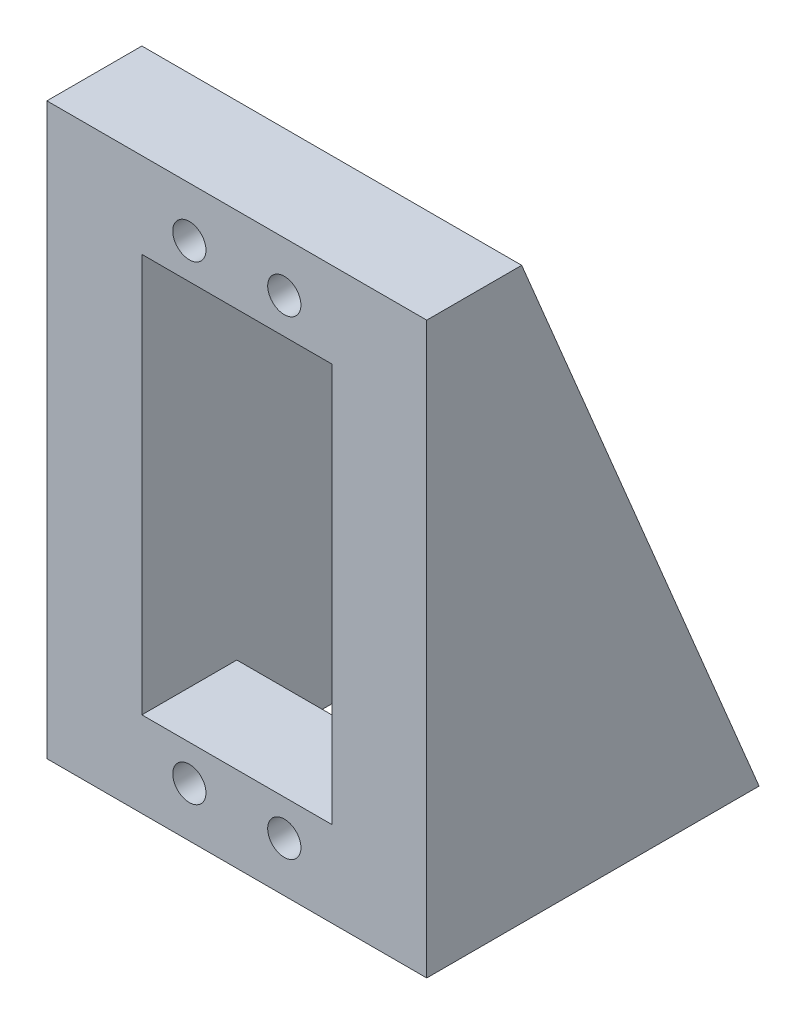
ISO-10303-21;
HEADER;
FILE_DESCRIPTION(('STEP AP214'),'2;1');
FILE_NAME('part.step','',(''),(''),'','','');
FILE_SCHEMA(('AUTOMOTIVE_DESIGN { 1 0 10303 214 1 1 1 1 }'));
ENDSEC;
DATA;
#1=APPLICATION_CONTEXT('core data for automotive mechanical design processes');
#2=APPLICATION_PROTOCOL_DEFINITION('international standard','automotive_design',2000,#1);
#3=PRODUCT_CONTEXT('',#1,'mechanical');
#4=PRODUCT('Part','Part','',(#3));
#5=PRODUCT_RELATED_PRODUCT_CATEGORY('part','',(#4));
#6=PRODUCT_DEFINITION_FORMATION('','',#4);
#7=PRODUCT_DEFINITION_CONTEXT('part definition',#1,'design');
#8=PRODUCT_DEFINITION('design','',#6,#7);
#9=PRODUCT_DEFINITION_SHAPE('','',#8);
#10=(LENGTH_UNIT() NAMED_UNIT(*) SI_UNIT(.MILLI.,.METRE.));
#11=(NAMED_UNIT(*) PLANE_ANGLE_UNIT() SI_UNIT($,.RADIAN.));
#12=(NAMED_UNIT(*) SI_UNIT($,.STERADIAN.) SOLID_ANGLE_UNIT());
#13=UNCERTAINTY_MEASURE_WITH_UNIT(LENGTH_MEASURE(1.E-05),#10,'distance_accuracy_value','');
#14=(GEOMETRIC_REPRESENTATION_CONTEXT(3) GLOBAL_UNCERTAINTY_ASSIGNED_CONTEXT((#13)) GLOBAL_UNIT_ASSIGNED_CONTEXT((#10,
#11,#12)) REPRESENTATION_CONTEXT('',''));
#15=CARTESIAN_POINT('',(0.,0.,0.));
#16=DIRECTION('',(0.,0.,1.));
#17=DIRECTION('',(1.,0.,0.));
#18=AXIS2_PLACEMENT_3D('',#15,#16,#17);
#19=CARTESIAN_POINT('',(0.,-30.,10.));
#20=DIRECTION('',(0.,1.,0.));
#21=DIRECTION('',(-1.,0.,0.));
#22=AXIS2_PLACEMENT_3D('',#19,#20,#21);
#23=PLANE('',#22);
#24=CARTESIAN_POINT('',(-16.,-30.,-6.7433949));
#25=DIRECTION('',(0.,-1.,0.));
#26=DIRECTION('',(1.,0.,0.));
#27=AXIS2_PLACEMENT_3D('',#24,#25,#26);
#28=CIRCLE('',#27,1.25);
#29=CARTESIAN_POINT('',(-14.75,-30.,-6.7433949));
#30=VERTEX_POINT('',#29);
#31=EDGE_CURVE('E563',#30,#30,#28,.T.);
#32=ORIENTED_EDGE('',*,*,#31,.F.);
#33=EDGE_LOOP('',(#32));
#34=FACE_BOUND('',#33,.T.);
#35=CARTESIAN_POINT('',(-16.,-30.,-16.7433949));
#36=DIRECTION('',(0.,-1.,0.));
#37=DIRECTION('',(1.,0.,0.));
#38=AXIS2_PLACEMENT_3D('',#35,#36,#37);
#39=CIRCLE('',#38,1.25);
#40=CARTESIAN_POINT('',(-14.75,-30.,-16.7433949));
#41=VERTEX_POINT('',#40);
#42=EDGE_CURVE('E564',#41,#41,#39,.T.);
#43=ORIENTED_EDGE('',*,*,#42,.F.);
#44=EDGE_LOOP('',(#43));
#45=FACE_BOUND('',#44,.T.);
#46=CARTESIAN_POINT('',(-16.,-30.,3.2566051));
#47=DIRECTION('',(0.,-1.,0.));
#48=DIRECTION('',(1.,0.,0.));
#49=AXIS2_PLACEMENT_3D('',#46,#47,#48);
#50=CIRCLE('',#49,1.25);
#51=CARTESIAN_POINT('',(-14.75,-30.,3.2566051));
#52=VERTEX_POINT('',#51);
#53=EDGE_CURVE('E149',#52,#52,#50,.T.);
#54=ORIENTED_EDGE('',*,*,#53,.F.);
#55=EDGE_LOOP('',(#54));
#56=FACE_BOUND('',#55,.T.);
#57=DIRECTION('',(0.,0.,-1.));
#58=VECTOR('',#57,1.);
#59=CARTESIAN_POINT('',(-20.,-30.,10.));
#60=LINE('',#59,#58);
#61=CARTESIAN_POINT('',(-20.,-30.,10.));
#62=VERTEX_POINT('',#61);
#63=CARTESIAN_POINT('',(-20.,-30.,-25.));
#64=VERTEX_POINT('',#63);
#65=EDGE_CURVE('E118',#62,#64,#60,.T.);
#66=ORIENTED_EDGE('',*,*,#65,.T.);
#67=DIRECTION('',(1.,0.,0.));
#68=VECTOR('',#67,1.);
#69=CARTESIAN_POINT('',(-20.,-30.,-25.));
#70=LINE('',#69,#68);
#71=CARTESIAN_POINT('',(-9.99999999999999,-30.,-25.));
#72=VERTEX_POINT('',#71);
#73=EDGE_CURVE('E122',#64,#72,#70,.T.);
#74=ORIENTED_EDGE('',*,*,#73,.T.);
#75=DIRECTION('',(0.,0.,-1.));
#76=VECTOR('',#75,1.);
#77=CARTESIAN_POINT('',(-9.99999999999999,-30.,0.));
#78=LINE('',#77,#76);
#79=CARTESIAN_POINT('',(-9.99999999999999,-30.,0.));
#80=VERTEX_POINT('',#79);
#81=EDGE_CURVE('E151',#80,#72,#78,.T.);
#82=ORIENTED_EDGE('',*,*,#81,.F.);
#83=DIRECTION('',(1.,0.,0.));
#84=VECTOR('',#83,1.);
#85=CARTESIAN_POINT('',(0.,-30.,0.));
#86=LINE('',#85,#84);
#87=CARTESIAN_POINT('',(10.,-30.,0.));
#88=VERTEX_POINT('',#87);
#89=EDGE_CURVE('E218',#80,#88,#86,.T.);
#90=ORIENTED_EDGE('',*,*,#89,.T.);
#91=DIRECTION('',(0.,0.,-1.));
#92=VECTOR('',#91,1.);
#93=CARTESIAN_POINT('',(10.,-30.,10.));
#94=LINE('',#93,#92);
#95=CARTESIAN_POINT('',(10.,-30.,-25.));
#96=VERTEX_POINT('',#95);
#97=EDGE_CURVE('E159',#88,#96,#94,.T.);
#98=ORIENTED_EDGE('',*,*,#97,.T.);
#99=DIRECTION('',(1.,0.,0.));
#100=VECTOR('',#99,1.);
#101=CARTESIAN_POINT('',(10.,-30.,-25.));
#102=LINE('',#101,#100);
#103=CARTESIAN_POINT('',(20.,-30.,-25.));
#104=VERTEX_POINT('',#103);
#105=EDGE_CURVE('E167',#96,#104,#102,.T.);
#106=ORIENTED_EDGE('',*,*,#105,.T.);
#107=DIRECTION('',(0.,0.,-1.));
#108=VECTOR('',#107,1.);
#109=CARTESIAN_POINT('',(20.,-30.,10.));
#110=LINE('',#109,#108);
#111=CARTESIAN_POINT('',(20.,-30.,10.));
#112=VERTEX_POINT('',#111);
#113=EDGE_CURVE('E226',#112,#104,#110,.T.);
#114=ORIENTED_EDGE('',*,*,#113,.F.);
#115=DIRECTION('',(1.,0.,0.));
#116=VECTOR('',#115,1.);
#117=CARTESIAN_POINT('',(0.,-30.,10.));
#118=LINE('',#117,#116);
#119=EDGE_CURVE('E125',#62,#112,#118,.T.);
#120=ORIENTED_EDGE('',*,*,#119,.F.);
#121=EDGE_LOOP('',(#66,#74,#82,#90,#98,#106,#114,#120));
#122=FACE_BOUND('',#121,.T.);
#123=CARTESIAN_POINT('',(16.,-30.,-16.7433949));
#124=DIRECTION('',(0.,1.,0.));
#125=DIRECTION('',(-1.,0.,0.));
#126=AXIS2_PLACEMENT_3D('',#123,#124,#125);
#127=CIRCLE('',#126,1.25);
#128=CARTESIAN_POINT('',(14.75,-30.,-16.7433949));
#129=VERTEX_POINT('',#128);
#130=EDGE_CURVE('E586',#129,#129,#127,.T.);
#131=ORIENTED_EDGE('',*,*,#130,.T.);
#132=EDGE_LOOP('',(#131));
#133=FACE_BOUND('',#132,.T.);
#134=CARTESIAN_POINT('',(16.,-30.,-6.7433949));
#135=DIRECTION('',(0.,1.,0.));
#136=DIRECTION('',(-1.,0.,0.));
#137=AXIS2_PLACEMENT_3D('',#134,#135,#136);
#138=CIRCLE('',#137,1.25);
#139=CARTESIAN_POINT('',(14.75,-30.,-6.7433949));
#140=VERTEX_POINT('',#139);
#141=EDGE_CURVE('E581',#140,#140,#138,.T.);
#142=ORIENTED_EDGE('',*,*,#141,.T.);
#143=EDGE_LOOP('',(#142));
#144=FACE_BOUND('',#143,.T.);
#145=CARTESIAN_POINT('',(16.,-30.,3.2566051));
#146=DIRECTION('',(0.,1.,0.));
#147=DIRECTION('',(-1.,0.,0.));
#148=AXIS2_PLACEMENT_3D('',#145,#146,#147);
#149=CIRCLE('',#148,1.25);
#150=CARTESIAN_POINT('',(14.75,-30.,3.2566051));
#151=VERTEX_POINT('',#150);
#152=EDGE_CURVE('E575',#151,#151,#149,.T.);
#153=ORIENTED_EDGE('',*,*,#152,.T.);
#154=EDGE_LOOP('',(#153));
#155=FACE_BOUND('',#154,.T.);
#156=ADVANCED_FACE('F34',(#34,#45,#56,#122,#133,#144,#155),#23,.F.);
#157=CARTESIAN_POINT('',(0.,21.,10.));
#158=DIRECTION('',(0.,1.,0.));
#159=DIRECTION('',(0.,0.,1.));
#160=AXIS2_PLACEMENT_3D('',#157,#158,#159);
#161=PLANE('',#160);
#162=DIRECTION('',(0.,0.,1.));
#163=VECTOR('',#162,1.);
#164=CARTESIAN_POINT('',(-9.99999999999998,21.,10.));
#165=LINE('',#164,#163);
#166=CARTESIAN_POINT('',(-9.99999999999998,21.,0.));
#167=VERTEX_POINT('',#166);
#168=CARTESIAN_POINT('',(-9.99999999999998,21.,10.));
#169=VERTEX_POINT('',#168);
#170=EDGE_CURVE('E156',#167,#169,#165,.T.);
#171=ORIENTED_EDGE('',*,*,#170,.F.);
#172=DIRECTION('',(1.,0.,0.));
#173=VECTOR('',#172,1.);
#174=CARTESIAN_POINT('',(0.,21.,0.));
#175=LINE('',#174,#173);
#176=CARTESIAN_POINT('',(10.,21.,0.));
#177=VERTEX_POINT('',#176);
#178=EDGE_CURVE('E208',#167,#177,#175,.T.);
#179=ORIENTED_EDGE('',*,*,#178,.T.);
#180=DIRECTION('',(0.,0.,1.));
#181=VECTOR('',#180,1.);
#182=CARTESIAN_POINT('',(10.,21.,10.));
#183=LINE('',#182,#181);
#184=CARTESIAN_POINT('',(10.,21.,10.));
#185=VERTEX_POINT('',#184);
#186=EDGE_CURVE('E177',#177,#185,#183,.T.);
#187=ORIENTED_EDGE('',*,*,#186,.T.);
#188=DIRECTION('',(1.,0.,0.));
#189=VECTOR('',#188,1.);
#190=CARTESIAN_POINT('',(0.,21.,10.));
#191=LINE('',#190,#189);
#192=EDGE_CURVE('E57',#169,#185,#191,.T.);
#193=ORIENTED_EDGE('',*,*,#192,.F.);
#194=EDGE_LOOP('',(#171,#179,#187,#193));
#195=FACE_BOUND('',#194,.T.);
#196=ADVANCED_FACE('F288',(#195),#161,.F.);
#197=CARTESIAN_POINT('',(0.,-21.,10.));
#198=DIRECTION('',(0.,1.,0.));
#199=DIRECTION('',(0.,0.,1.));
#200=AXIS2_PLACEMENT_3D('',#197,#198,#199);
#201=PLANE('',#200);
#202=DIRECTION('',(1.,0.,0.));
#203=VECTOR('',#202,1.);
#204=CARTESIAN_POINT('',(0.,-21.,0.));
#205=LINE('',#204,#203);
#206=CARTESIAN_POINT('',(-9.99999999999998,-21.,0.));
#207=VERTEX_POINT('',#206);
#208=CARTESIAN_POINT('',(10.,-21.,0.));
#209=VERTEX_POINT('',#208);
#210=EDGE_CURVE('E210',#207,#209,#205,.T.);
#211=ORIENTED_EDGE('',*,*,#210,.F.);
#212=DIRECTION('',(0.,0.,1.));
#213=VECTOR('',#212,1.);
#214=CARTESIAN_POINT('',(-9.99999999999999,-21.,10.));
#215=LINE('',#214,#213);
#216=CARTESIAN_POINT('',(-9.99999999999998,-21.,10.));
#217=VERTEX_POINT('',#216);
#218=EDGE_CURVE('E49',#207,#217,#215,.T.);
#219=ORIENTED_EDGE('',*,*,#218,.T.);
#220=DIRECTION('',(1.,0.,0.));
#221=VECTOR('',#220,1.);
#222=CARTESIAN_POINT('',(0.,-21.,10.));
#223=LINE('',#222,#221);
#224=CARTESIAN_POINT('',(10.,-21.,10.));
#225=VERTEX_POINT('',#224);
#226=EDGE_CURVE('E188',#217,#225,#223,.T.);
#227=ORIENTED_EDGE('',*,*,#226,.T.);
#228=DIRECTION('',(0.,0.,1.));
#229=VECTOR('',#228,1.);
#230=CARTESIAN_POINT('',(10.,-21.,10.));
#231=LINE('',#230,#229);
#232=EDGE_CURVE('E172',#209,#225,#231,.T.);
#233=ORIENTED_EDGE('',*,*,#232,.F.);
#234=EDGE_LOOP('',(#211,#219,#227,#233));
#235=FACE_BOUND('',#234,.T.);
#236=ADVANCED_FACE('F283',(#235),#201,.T.);
#237=CARTESIAN_POINT('',(0.,0.,0.));
#238=DIRECTION('',(0.,0.,1.));
#239=DIRECTION('',(1.,0.,0.));
#240=AXIS2_PLACEMENT_3D('',#237,#238,#239);
#241=PLANE('',#240);
#242=CARTESIAN_POINT('',(-5.,24.75,0.));
#243=DIRECTION('',(0.,0.,1.));
#244=DIRECTION('',(1.,0.,0.));
#245=AXIS2_PLACEMENT_3D('',#242,#243,#244);
#246=CIRCLE('',#245,1.75);
#247=CARTESIAN_POINT('',(-3.25,24.75,0.));
#248=VERTEX_POINT('',#247);
#249=EDGE_CURVE('E215',#248,#248,#246,.T.);
#250=ORIENTED_EDGE('',*,*,#249,.T.);
#251=EDGE_LOOP('',(#250));
#252=FACE_BOUND('',#251,.T.);
#253=CARTESIAN_POINT('',(5.,24.75,0.));
#254=DIRECTION('',(0.,0.,1.));
#255=DIRECTION('',(1.,0.,0.));
#256=AXIS2_PLACEMENT_3D('',#253,#254,#255);
#257=CIRCLE('',#256,1.75);
#258=CARTESIAN_POINT('',(6.75,24.75,0.));
#259=VERTEX_POINT('',#258);
#260=EDGE_CURVE('E212',#259,#259,#257,.T.);
#261=ORIENTED_EDGE('',*,*,#260,.T.);
#262=EDGE_LOOP('',(#261));
#263=FACE_BOUND('',#262,.T.);
#264=DIRECTION('',(0.,-1.,0.));
#265=VECTOR('',#264,1.);
#266=CARTESIAN_POINT('',(-9.99999999999998,0.,0.));
#267=LINE('',#266,#265);
#268=CARTESIAN_POINT('',(-9.99999999999998,30.,0.));
#269=VERTEX_POINT('',#268);
#270=EDGE_CURVE('E11',#269,#167,#267,.T.);
#271=ORIENTED_EDGE('',*,*,#270,.F.);
#272=DIRECTION('',(1.,0.,0.));
#273=VECTOR('',#272,1.);
#274=CARTESIAN_POINT('',(0.,30.,0.));
#275=LINE('',#274,#273);
#276=CARTESIAN_POINT('',(10.,30.,0.));
#277=VERTEX_POINT('',#276);
#278=EDGE_CURVE('E220',#269,#277,#275,.T.);
#279=ORIENTED_EDGE('',*,*,#278,.T.);
#280=DIRECTION('',(0.,-1.,0.));
#281=VECTOR('',#280,1.);
#282=CARTESIAN_POINT('',(10.,0.,0.));
#283=LINE('',#282,#281);
#284=EDGE_CURVE('E229',#277,#177,#283,.T.);
#285=ORIENTED_EDGE('',*,*,#284,.T.);
#286=ORIENTED_EDGE('',*,*,#178,.F.);
#287=EDGE_LOOP('',(#271,#279,#285,#286));
#288=FACE_BOUND('',#287,.T.);
#289=ADVANCED_FACE('F279',(#252,#263,#288),#241,.F.);
#290=CARTESIAN_POINT('',(-4.99999999999999,-24.75,0.));
#291=DIRECTION('',(0.,0.,1.));
#292=DIRECTION('',(1.,0.,0.));
#293=AXIS2_PLACEMENT_3D('',#290,#291,#292);
#294=CIRCLE('',#293,1.75);
#295=CARTESIAN_POINT('',(-3.24999999999999,-24.75,0.));
#296=VERTEX_POINT('',#295);
#297=EDGE_CURVE('E205',#296,#296,#294,.T.);
#298=ORIENTED_EDGE('',*,*,#297,.T.);
#299=EDGE_LOOP('',(#298));
#300=FACE_BOUND('',#299,.T.);
#301=CARTESIAN_POINT('',(5.,-24.75,0.));
#302=DIRECTION('',(0.,0.,1.));
#303=DIRECTION('',(1.,0.,0.));
#304=AXIS2_PLACEMENT_3D('',#301,#302,#303);
#305=CIRCLE('',#304,1.75);
#306=CARTESIAN_POINT('',(6.75000000000001,-24.75,0.));
#307=VERTEX_POINT('',#306);
#308=EDGE_CURVE('E179',#307,#307,#305,.T.);
#309=ORIENTED_EDGE('',*,*,#308,.T.);
#310=EDGE_LOOP('',(#309));
#311=FACE_BOUND('',#310,.T.);
#312=EDGE_CURVE('E38',#207,#80,#267,.T.);
#313=ORIENTED_EDGE('',*,*,#312,.F.);
#314=ORIENTED_EDGE('',*,*,#210,.T.);
#315=EDGE_CURVE('E227',#209,#88,#283,.T.);
#316=ORIENTED_EDGE('',*,*,#315,.T.);
#317=ORIENTED_EDGE('',*,*,#89,.F.);
#318=EDGE_LOOP('',(#313,#314,#316,#317));
#319=FACE_BOUND('',#318,.T.);
#320=ADVANCED_FACE('F282',(#300,#311,#319),#241,.F.);
#321=CARTESIAN_POINT('',(20.,0.,10.));
#322=DIRECTION('',(-1.,0.,0.));
#323=DIRECTION('',(0.,-1.,0.));
#324=AXIS2_PLACEMENT_3D('',#321,#322,#323);
#325=PLANE('',#324);
#326=ORIENTED_EDGE('',*,*,#113,.T.);
#327=DIRECTION('',(0.,0.923076923076923,0.384615384615385));
#328=VECTOR('',#327,1.);
#329=CARTESIAN_POINT('',(20.,-30.,-25.));
#330=LINE('',#329,#328);
#331=CARTESIAN_POINT('',(20.,30.,0.));
#332=VERTEX_POINT('',#331);
#333=EDGE_CURVE('E158',#104,#332,#330,.T.);
#334=ORIENTED_EDGE('',*,*,#333,.T.);
#335=DIRECTION('',(0.,0.,-1.));
#336=VECTOR('',#335,1.);
#337=CARTESIAN_POINT('',(20.,30.,10.));
#338=LINE('',#337,#336);
#339=CARTESIAN_POINT('',(20.,30.,10.));
#340=VERTEX_POINT('',#339);
#341=EDGE_CURVE('E223',#340,#332,#338,.T.);
#342=ORIENTED_EDGE('',*,*,#341,.F.);
#343=DIRECTION('',(0.,1.,0.));
#344=VECTOR('',#343,1.);
#345=CARTESIAN_POINT('',(20.,0.,10.));
#346=LINE('',#345,#344);
#347=EDGE_CURVE('E197',#112,#340,#346,.T.);
#348=ORIENTED_EDGE('',*,*,#347,.F.);
#349=EDGE_LOOP('',(#326,#334,#342,#348));
#350=FACE_BOUND('',#349,.T.);
#351=ADVANCED_FACE('F257',(#350),#325,.F.);
#352=CARTESIAN_POINT('',(0.,30.,10.));
#353=DIRECTION('',(0.,1.,0.));
#354=DIRECTION('',(0.,0.,1.));
#355=AXIS2_PLACEMENT_3D('',#352,#353,#354);
#356=PLANE('',#355);
#357=DIRECTION('',(1.,0.,0.));
#358=VECTOR('',#357,1.);
#359=CARTESIAN_POINT('',(0.,30.,10.));
#360=LINE('',#359,#358);
#361=CARTESIAN_POINT('',(-20.,30.,10.));
#362=VERTEX_POINT('',#361);
#363=EDGE_CURVE('E200',#362,#340,#360,.T.);
#364=ORIENTED_EDGE('',*,*,#363,.T.);
#365=ORIENTED_EDGE('',*,*,#341,.T.);
#366=DIRECTION('',(1.,0.,0.));
#367=VECTOR('',#366,1.);
#368=CARTESIAN_POINT('',(10.,30.,0.));
#369=LINE('',#368,#367);
#370=EDGE_CURVE('E169',#277,#332,#369,.T.);
#371=ORIENTED_EDGE('',*,*,#370,.F.);
#372=ORIENTED_EDGE('',*,*,#278,.F.);
#373=CARTESIAN_POINT('',(-20.,30.,0.));
#374=VERTEX_POINT('',#373);
#375=EDGE_CURVE('E184',#374,#269,#275,.T.);
#376=ORIENTED_EDGE('',*,*,#375,.F.);
#377=DIRECTION('',(0.,0.,-1.));
#378=VECTOR('',#377,1.);
#379=CARTESIAN_POINT('',(-20.,30.,10.));
#380=LINE('',#379,#378);
#381=EDGE_CURVE('E130',#362,#374,#380,.T.);
#382=ORIENTED_EDGE('',*,*,#381,.F.);
#383=EDGE_LOOP('',(#364,#365,#371,#372,#376,#382));
#384=FACE_BOUND('',#383,.T.);
#385=ADVANCED_FACE('F252',(#384),#356,.T.);
#386=CARTESIAN_POINT('',(-5.,24.75,10.));
#387=DIRECTION('',(0.,0.,-1.));
#388=DIRECTION('',(-1.,0.,0.));
#389=AXIS2_PLACEMENT_3D('',#386,#387,#388);
#390=CYLINDRICAL_SURFACE('',#389,1.75);
#391=CARTESIAN_POINT('',(-5.,24.75,10.));
#392=DIRECTION('',(0.,0.,1.));
#393=DIRECTION('',(1.,0.,0.));
#394=AXIS2_PLACEMENT_3D('',#391,#392,#393);
#395=CIRCLE('',#394,1.75);
#396=CARTESIAN_POINT('',(-3.25,24.75,10.));
#397=VERTEX_POINT('',#396);
#398=EDGE_CURVE('E193',#397,#397,#395,.T.);
#399=ORIENTED_EDGE('',*,*,#398,.T.);
#400=EDGE_LOOP('',(#399));
#401=FACE_BOUND('',#400,.T.);
#402=ORIENTED_EDGE('',*,*,#249,.F.);
#403=EDGE_LOOP('',(#402));
#404=FACE_BOUND('',#403,.T.);
#405=ADVANCED_FACE('F272',(#401,#404),#390,.F.);
#406=CARTESIAN_POINT('',(5.,24.75,10.));
#407=DIRECTION('',(0.,0.,-1.));
#408=DIRECTION('',(-1.,0.,0.));
#409=AXIS2_PLACEMENT_3D('',#406,#407,#408);
#410=CYLINDRICAL_SURFACE('',#409,1.75);
#411=CARTESIAN_POINT('',(5.,24.75,10.));
#412=DIRECTION('',(0.,0.,1.));
#413=DIRECTION('',(1.,0.,0.));
#414=AXIS2_PLACEMENT_3D('',#411,#412,#413);
#415=CIRCLE('',#414,1.75);
#416=CARTESIAN_POINT('',(6.75,24.75,10.));
#417=VERTEX_POINT('',#416);
#418=EDGE_CURVE('E190',#417,#417,#415,.T.);
#419=ORIENTED_EDGE('',*,*,#418,.T.);
#420=EDGE_LOOP('',(#419));
#421=FACE_BOUND('',#420,.T.);
#422=ORIENTED_EDGE('',*,*,#260,.F.);
#423=EDGE_LOOP('',(#422));
#424=FACE_BOUND('',#423,.T.);
#425=ADVANCED_FACE('F275',(#421,#424),#410,.F.);
#426=CARTESIAN_POINT('',(-4.99999999999999,-24.75,10.));
#427=DIRECTION('',(0.,0.,-1.));
#428=DIRECTION('',(-1.,0.,0.));
#429=AXIS2_PLACEMENT_3D('',#426,#427,#428);
#430=CYLINDRICAL_SURFACE('',#429,1.75);
#431=CARTESIAN_POINT('',(-4.99999999999999,-24.75,10.));
#432=DIRECTION('',(0.,0.,1.));
#433=DIRECTION('',(1.,0.,0.));
#434=AXIS2_PLACEMENT_3D('',#431,#432,#433);
#435=CIRCLE('',#434,1.75);
#436=CARTESIAN_POINT('',(-3.24999999999999,-24.75,10.));
#437=VERTEX_POINT('',#436);
#438=EDGE_CURVE('E183',#437,#437,#435,.T.);
#439=ORIENTED_EDGE('',*,*,#438,.T.);
#440=EDGE_LOOP('',(#439));
#441=FACE_BOUND('',#440,.T.);
#442=ORIENTED_EDGE('',*,*,#297,.F.);
#443=EDGE_LOOP('',(#442));
#444=FACE_BOUND('',#443,.T.);
#445=ADVANCED_FACE('F299',(#441,#444),#430,.F.);
#446=CARTESIAN_POINT('',(5.,-24.75,10.));
#447=DIRECTION('',(0.,0.,-1.));
#448=DIRECTION('',(-1.,0.,0.));
#449=AXIS2_PLACEMENT_3D('',#446,#447,#448);
#450=CYLINDRICAL_SURFACE('',#449,1.75);
#451=CARTESIAN_POINT('',(5.,-24.75,10.));
#452=DIRECTION('',(0.,0.,1.));
#453=DIRECTION('',(1.,0.,0.));
#454=AXIS2_PLACEMENT_3D('',#451,#452,#453);
#455=CIRCLE('',#454,1.75);
#456=CARTESIAN_POINT('',(6.75000000000001,-24.75,10.));
#457=VERTEX_POINT('',#456);
#458=EDGE_CURVE('E180',#457,#457,#455,.T.);
#459=ORIENTED_EDGE('',*,*,#458,.T.);
#460=EDGE_LOOP('',(#459));
#461=FACE_BOUND('',#460,.T.);
#462=ORIENTED_EDGE('',*,*,#308,.F.);
#463=EDGE_LOOP('',(#462));
#464=FACE_BOUND('',#463,.T.);
#465=ADVANCED_FACE('F36',(#461,#464),#450,.F.);
#466=CARTESIAN_POINT('',(-20.,0.,10.));
#467=DIRECTION('',(-1.,0.,0.));
#468=DIRECTION('',(0.,-1.,0.));
#469=AXIS2_PLACEMENT_3D('',#466,#467,#468);
#470=PLANE('',#469);
#471=ORIENTED_EDGE('',*,*,#381,.T.);
#472=DIRECTION('',(0.,0.923076923076923,0.384615384615385));
#473=VECTOR('',#472,1.);
#474=CARTESIAN_POINT('',(-20.,-30.,-25.));
#475=LINE('',#474,#473);
#476=EDGE_CURVE('E137',#64,#374,#475,.T.);
#477=ORIENTED_EDGE('',*,*,#476,.F.);
#478=ORIENTED_EDGE('',*,*,#65,.F.);
#479=DIRECTION('',(0.,1.,0.));
#480=VECTOR('',#479,1.);
#481=CARTESIAN_POINT('',(-20.,0.,10.));
#482=LINE('',#481,#480);
#483=EDGE_CURVE('E131',#62,#362,#482,.T.);
#484=ORIENTED_EDGE('',*,*,#483,.T.);
#485=EDGE_LOOP('',(#471,#477,#478,#484));
#486=FACE_BOUND('',#485,.T.);
#487=ADVANCED_FACE('F141',(#486),#470,.T.);
#488=CARTESIAN_POINT('',(0.,0.,10.));
#489=DIRECTION('',(0.,0.,1.));
#490=DIRECTION('',(1.,0.,0.));
#491=AXIS2_PLACEMENT_3D('',#488,#489,#490);
#492=PLANE('',#491);
#493=DIRECTION('',(0.,-1.,0.));
#494=VECTOR('',#493,1.);
#495=CARTESIAN_POINT('',(-9.99999999999998,30.,10.));
#496=LINE('',#495,#494);
#497=EDGE_CURVE('E143',#169,#217,#496,.T.);
#498=ORIENTED_EDGE('',*,*,#497,.F.);
#499=ORIENTED_EDGE('',*,*,#192,.T.);
#500=DIRECTION('',(0.,-1.,0.));
#501=VECTOR('',#500,1.);
#502=CARTESIAN_POINT('',(10.,30.,10.));
#503=LINE('',#502,#501);
#504=EDGE_CURVE('E164',#185,#225,#503,.T.);
#505=ORIENTED_EDGE('',*,*,#504,.T.);
#506=ORIENTED_EDGE('',*,*,#226,.F.);
#507=EDGE_LOOP('',(#498,#499,#505,#506));
#508=FACE_BOUND('',#507,.T.);
#509=ORIENTED_EDGE('',*,*,#347,.T.);
#510=ORIENTED_EDGE('',*,*,#363,.F.);
#511=ORIENTED_EDGE('',*,*,#483,.F.);
#512=ORIENTED_EDGE('',*,*,#119,.T.);
#513=EDGE_LOOP('',(#509,#510,#511,#512));
#514=FACE_BOUND('',#513,.T.);
#515=ORIENTED_EDGE('',*,*,#458,.F.);
#516=EDGE_LOOP('',(#515));
#517=FACE_BOUND('',#516,.T.);
#518=ORIENTED_EDGE('',*,*,#438,.F.);
#519=EDGE_LOOP('',(#518));
#520=FACE_BOUND('',#519,.T.);
#521=ORIENTED_EDGE('',*,*,#418,.F.);
#522=EDGE_LOOP('',(#521));
#523=FACE_BOUND('',#522,.T.);
#524=ORIENTED_EDGE('',*,*,#398,.F.);
#525=EDGE_LOOP('',(#524));
#526=FACE_BOUND('',#525,.T.);
#527=ADVANCED_FACE('F259',(#508,#514,#517,#520,#523,#526),#492,.T.);
#528=CARTESIAN_POINT('',(10.,0.,0.));
#529=DIRECTION('',(-1.,0.,0.));
#530=DIRECTION('',(0.,-1.,0.));
#531=AXIS2_PLACEMENT_3D('',#528,#529,#530);
#532=PLANE('',#531);
#533=ORIENTED_EDGE('',*,*,#186,.F.);
#534=ORIENTED_EDGE('',*,*,#284,.F.);
#535=DIRECTION('',(0.,0.923076923076923,0.384615384615385));
#536=VECTOR('',#535,1.);
#537=CARTESIAN_POINT('',(10.,-30.,-25.));
#538=LINE('',#537,#536);
#539=EDGE_CURVE('E161',#96,#277,#538,.T.);
#540=ORIENTED_EDGE('',*,*,#539,.F.);
#541=ORIENTED_EDGE('',*,*,#97,.F.);
#542=ORIENTED_EDGE('',*,*,#315,.F.);
#543=ORIENTED_EDGE('',*,*,#232,.T.);
#544=ORIENTED_EDGE('',*,*,#504,.F.);
#545=EDGE_LOOP('',(#533,#534,#540,#541,#542,#543,#544));
#546=FACE_BOUND('',#545,.T.);
#547=ADVANCED_FACE('F244',(#546),#532,.T.);
#548=CARTESIAN_POINT('',(10.,-30.,-25.));
#549=DIRECTION('',(0.,0.384615384615385,-0.923076923076923));
#550=DIRECTION('',(0.,0.923076923076923,0.384615384615385));
#551=AXIS2_PLACEMENT_3D('',#548,#549,#550);
#552=PLANE('',#551);
#553=ORIENTED_EDGE('',*,*,#333,.F.);
#554=ORIENTED_EDGE('',*,*,#105,.F.);
#555=ORIENTED_EDGE('',*,*,#539,.T.);
#556=ORIENTED_EDGE('',*,*,#370,.T.);
#557=EDGE_LOOP('',(#553,#554,#555,#556));
#558=FACE_BOUND('',#557,.T.);
#559=ADVANCED_FACE('F249',(#558),#552,.T.);
#560=CARTESIAN_POINT('',(-9.99999999999998,0.,0.));
#561=DIRECTION('',(-1.,0.,0.));
#562=DIRECTION('',(0.,-1.,0.));
#563=AXIS2_PLACEMENT_3D('',#560,#561,#562);
#564=PLANE('',#563);
#565=ORIENTED_EDGE('',*,*,#270,.T.);
#566=ORIENTED_EDGE('',*,*,#170,.T.);
#567=ORIENTED_EDGE('',*,*,#497,.T.);
#568=ORIENTED_EDGE('',*,*,#218,.F.);
#569=ORIENTED_EDGE('',*,*,#312,.T.);
#570=ORIENTED_EDGE('',*,*,#81,.T.);
#571=DIRECTION('',(0.,0.923076923076923,0.384615384615385));
#572=VECTOR('',#571,1.);
#573=CARTESIAN_POINT('',(-9.99999999999999,-30.,-25.));
#574=LINE('',#573,#572);
#575=EDGE_CURVE('E139',#72,#269,#574,.T.);
#576=ORIENTED_EDGE('',*,*,#575,.T.);
#577=EDGE_LOOP('',(#565,#566,#567,#568,#569,#570,#576));
#578=FACE_BOUND('',#577,.T.);
#579=ADVANCED_FACE('F238',(#578),#564,.F.);
#580=CARTESIAN_POINT('',(-20.,-30.,-25.));
#581=DIRECTION('',(0.,0.384615384615385,-0.923076923076923));
#582=DIRECTION('',(0.,0.923076923076923,0.384615384615385));
#583=AXIS2_PLACEMENT_3D('',#580,#581,#582);
#584=PLANE('',#583);
#585=ORIENTED_EDGE('',*,*,#575,.F.);
#586=ORIENTED_EDGE('',*,*,#73,.F.);
#587=ORIENTED_EDGE('',*,*,#476,.T.);
#588=ORIENTED_EDGE('',*,*,#375,.T.);
#589=EDGE_LOOP('',(#585,#586,#587,#588));
#590=FACE_BOUND('',#589,.T.);
#591=ADVANCED_FACE('F135',(#590),#584,.T.);
#592=CARTESIAN_POINT('',(-16.,-18.,3.2566051));
#593=DIRECTION('',(0.,-1.,0.));
#594=DIRECTION('',(1.,0.,0.));
#595=AXIS2_PLACEMENT_3D('',#592,#593,#594);
#596=CYLINDRICAL_SURFACE('',#595,1.25);
#597=CARTESIAN_POINT('',(-16.,-18.,3.2566051));
#598=DIRECTION('',(0.,-1.,0.));
#599=DIRECTION('',(1.,0.,0.));
#600=AXIS2_PLACEMENT_3D('',#597,#598,#599);
#601=CIRCLE('',#600,1.25);
#602=CARTESIAN_POINT('',(-14.75,-18.,3.2566051));
#603=VERTEX_POINT('',#602);
#604=EDGE_CURVE('E153',#603,#603,#601,.T.);
#605=ORIENTED_EDGE('',*,*,#604,.F.);
#606=EDGE_LOOP('',(#605));
#607=FACE_BOUND('',#606,.T.);
#608=ORIENTED_EDGE('',*,*,#53,.T.);
#609=EDGE_LOOP('',(#608));
#610=FACE_BOUND('',#609,.T.);
#611=ADVANCED_FACE('F420',(#607,#610),#596,.F.);
#612=CARTESIAN_POINT('',(-16.,-18.,3.2566051));
#613=DIRECTION('',(0.,-1.,0.));
#614=DIRECTION('',(1.,0.,0.));
#615=AXIS2_PLACEMENT_3D('',#612,#613,#614);
#616=PLANE('',#615);
#617=ORIENTED_EDGE('',*,*,#604,.T.);
#618=EDGE_LOOP('',(#617));
#619=FACE_BOUND('',#618,.T.);
#620=ADVANCED_FACE('F445',(#619),#616,.T.);
#621=CARTESIAN_POINT('',(16.,-18.,-16.7433949));
#622=DIRECTION('',(0.,-1.,0.));
#623=DIRECTION('',(1.,0.,0.));
#624=AXIS2_PLACEMENT_3D('',#621,#622,#623);
#625=CYLINDRICAL_SURFACE('',#624,1.25);
#626=CARTESIAN_POINT('',(16.,-18.,-16.7433949));
#627=DIRECTION('',(0.,1.,0.));
#628=DIRECTION('',(-1.,0.,0.));
#629=AXIS2_PLACEMENT_3D('',#626,#627,#628);
#630=CIRCLE('',#629,1.25);
#631=CARTESIAN_POINT('',(14.75,-18.,-16.7433949));
#632=VERTEX_POINT('',#631);
#633=EDGE_CURVE('E595',#632,#632,#630,.T.);
#634=ORIENTED_EDGE('',*,*,#633,.T.);
#635=EDGE_LOOP('',(#634));
#636=FACE_BOUND('',#635,.T.);
#637=ORIENTED_EDGE('',*,*,#130,.F.);
#638=EDGE_LOOP('',(#637));
#639=FACE_BOUND('',#638,.T.);
#640=ADVANCED_FACE('F454',(#636,#639),#625,.F.);
#641=CARTESIAN_POINT('',(16.,-18.,-16.7433949));
#642=DIRECTION('',(0.,1.,0.));
#643=DIRECTION('',(-1.,0.,0.));
#644=AXIS2_PLACEMENT_3D('',#641,#642,#643);
#645=PLANE('',#644);
#646=ORIENTED_EDGE('',*,*,#633,.F.);
#647=EDGE_LOOP('',(#646));
#648=FACE_BOUND('',#647,.T.);
#649=ADVANCED_FACE('F463',(#648),#645,.F.);
#650=CARTESIAN_POINT('',(16.,-18.,-6.7433949));
#651=DIRECTION('',(0.,-1.,0.));
#652=DIRECTION('',(1.,0.,0.));
#653=AXIS2_PLACEMENT_3D('',#650,#651,#652);
#654=CYLINDRICAL_SURFACE('',#653,1.25);
#655=CARTESIAN_POINT('',(16.,-18.,-6.7433949));
#656=DIRECTION('',(0.,1.,0.));
#657=DIRECTION('',(-1.,0.,0.));
#658=AXIS2_PLACEMENT_3D('',#655,#656,#657);
#659=CIRCLE('',#658,1.25);
#660=CARTESIAN_POINT('',(14.75,-18.,-6.7433949));
#661=VERTEX_POINT('',#660);
#662=EDGE_CURVE('E584',#661,#661,#659,.T.);
#663=ORIENTED_EDGE('',*,*,#662,.T.);
#664=EDGE_LOOP('',(#663));
#665=FACE_BOUND('',#664,.T.);
#666=ORIENTED_EDGE('',*,*,#141,.F.);
#667=EDGE_LOOP('',(#666));
#668=FACE_BOUND('',#667,.T.);
#669=ADVANCED_FACE('F472',(#665,#668),#654,.F.);
#670=CARTESIAN_POINT('',(16.,-18.,-6.7433949));
#671=DIRECTION('',(0.,1.,0.));
#672=DIRECTION('',(-1.,0.,0.));
#673=AXIS2_PLACEMENT_3D('',#670,#671,#672);
#674=PLANE('',#673);
#675=ORIENTED_EDGE('',*,*,#662,.F.);
#676=EDGE_LOOP('',(#675));
#677=FACE_BOUND('',#676,.T.);
#678=ADVANCED_FACE('F481',(#677),#674,.F.);
#679=CARTESIAN_POINT('',(16.,-18.,3.2566051));
#680=DIRECTION('',(0.,-1.,0.));
#681=DIRECTION('',(1.,0.,0.));
#682=AXIS2_PLACEMENT_3D('',#679,#680,#681);
#683=CYLINDRICAL_SURFACE('',#682,1.25);
#684=CARTESIAN_POINT('',(16.,-18.,3.2566051));
#685=DIRECTION('',(0.,1.,0.));
#686=DIRECTION('',(-1.,0.,0.));
#687=AXIS2_PLACEMENT_3D('',#684,#685,#686);
#688=CIRCLE('',#687,1.25);
#689=CARTESIAN_POINT('',(14.75,-18.,3.2566051));
#690=VERTEX_POINT('',#689);
#691=EDGE_CURVE('E578',#690,#690,#688,.T.);
#692=ORIENTED_EDGE('',*,*,#691,.T.);
#693=EDGE_LOOP('',(#692));
#694=FACE_BOUND('',#693,.T.);
#695=ORIENTED_EDGE('',*,*,#152,.F.);
#696=EDGE_LOOP('',(#695));
#697=FACE_BOUND('',#696,.T.);
#698=ADVANCED_FACE('F490',(#694,#697),#683,.F.);
#699=CARTESIAN_POINT('',(16.,-18.,3.2566051));
#700=DIRECTION('',(0.,1.,0.));
#701=DIRECTION('',(-1.,0.,0.));
#702=AXIS2_PLACEMENT_3D('',#699,#700,#701);
#703=PLANE('',#702);
#704=ORIENTED_EDGE('',*,*,#691,.F.);
#705=EDGE_LOOP('',(#704));
#706=FACE_BOUND('',#705,.T.);
#707=ADVANCED_FACE('F499',(#706),#703,.F.);
#708=CARTESIAN_POINT('',(-16.,-18.,-16.7433949));
#709=DIRECTION('',(0.,-1.,0.));
#710=DIRECTION('',(1.,0.,0.));
#711=AXIS2_PLACEMENT_3D('',#708,#709,#710);
#712=CYLINDRICAL_SURFACE('',#711,1.25);
#713=CARTESIAN_POINT('',(-16.,-18.,-16.7433949));
#714=DIRECTION('',(0.,-1.,0.));
#715=DIRECTION('',(1.,0.,0.));
#716=AXIS2_PLACEMENT_3D('',#713,#714,#715);
#717=CIRCLE('',#716,1.25);
#718=CARTESIAN_POINT('',(-14.75,-18.,-16.7433949));
#719=VERTEX_POINT('',#718);
#720=EDGE_CURVE('E569',#719,#719,#717,.T.);
#721=ORIENTED_EDGE('',*,*,#720,.F.);
#722=EDGE_LOOP('',(#721));
#723=FACE_BOUND('',#722,.T.);
#724=ORIENTED_EDGE('',*,*,#42,.T.);
#725=EDGE_LOOP('',(#724));
#726=FACE_BOUND('',#725,.T.);
#727=ADVANCED_FACE('F508',(#723,#726),#712,.F.);
#728=CARTESIAN_POINT('',(-16.,-18.,-16.7433949));
#729=DIRECTION('',(0.,-1.,0.));
#730=DIRECTION('',(1.,0.,0.));
#731=AXIS2_PLACEMENT_3D('',#728,#729,#730);
#732=PLANE('',#731);
#733=ORIENTED_EDGE('',*,*,#720,.T.);
#734=EDGE_LOOP('',(#733));
#735=FACE_BOUND('',#734,.T.);
#736=ADVANCED_FACE('F517',(#735),#732,.T.);
#737=CARTESIAN_POINT('',(-16.,-18.,-6.7433949));
#738=DIRECTION('',(0.,-1.,0.));
#739=DIRECTION('',(1.,0.,0.));
#740=AXIS2_PLACEMENT_3D('',#737,#738,#739);
#741=CYLINDRICAL_SURFACE('',#740,1.25);
#742=CARTESIAN_POINT('',(-16.,-18.,-6.7433949));
#743=DIRECTION('',(0.,-1.,0.));
#744=DIRECTION('',(1.,0.,0.));
#745=AXIS2_PLACEMENT_3D('',#742,#743,#744);
#746=CIRCLE('',#745,1.25);
#747=CARTESIAN_POINT('',(-14.75,-18.,-6.7433949));
#748=VERTEX_POINT('',#747);
#749=EDGE_CURVE('E562',#748,#748,#746,.T.);
#750=ORIENTED_EDGE('',*,*,#749,.F.);
#751=EDGE_LOOP('',(#750));
#752=FACE_BOUND('',#751,.T.);
#753=ORIENTED_EDGE('',*,*,#31,.T.);
#754=EDGE_LOOP('',(#753));
#755=FACE_BOUND('',#754,.T.);
#756=ADVANCED_FACE('F526',(#752,#755),#741,.F.);
#757=CARTESIAN_POINT('',(-16.,-18.,-6.7433949));
#758=DIRECTION('',(0.,-1.,0.));
#759=DIRECTION('',(1.,0.,0.));
#760=AXIS2_PLACEMENT_3D('',#757,#758,#759);
#761=PLANE('',#760);
#762=ORIENTED_EDGE('',*,*,#749,.T.);
#763=EDGE_LOOP('',(#762));
#764=FACE_BOUND('',#763,.T.);
#765=ADVANCED_FACE('F535',(#764),#761,.T.);
#766=CLOSED_SHELL('',(#156,#196,#236,#289,#320,#351,#385,#405,#425,#445,#465,#487,#527,#547,
#559,#579,#591,#611,#620,#640,#649,#669,#678,#698,#707,#727,#736,#756,#765));
#767=MANIFOLD_SOLID_BREP('B2',#766);
#768=ADVANCED_BREP_SHAPE_REPRESENTATION('',(#18,#767),#14);
#769=SHAPE_DEFINITION_REPRESENTATION(#9,#768);
ENDSEC;
END-ISO-10303-21;
